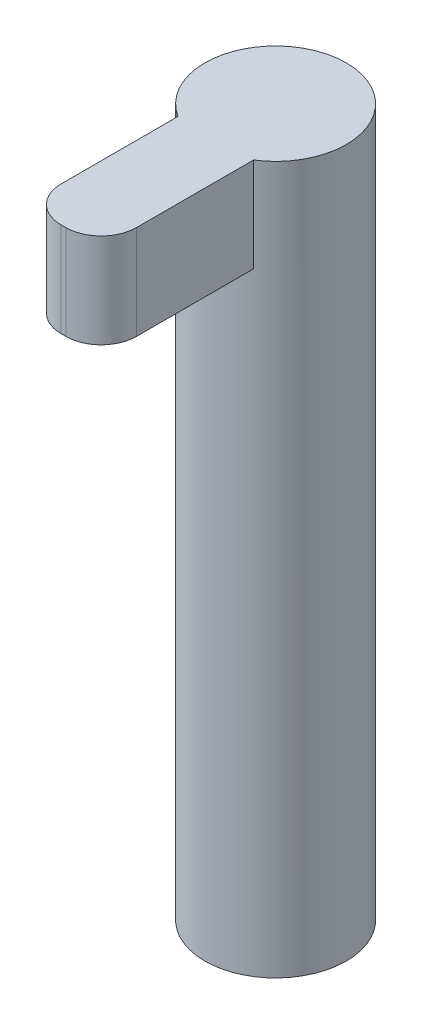
ISO-10303-21;
HEADER;
FILE_DESCRIPTION(('STEP AP214'),'2;1');
FILE_NAME('part.step','',(''),(''),'','','');
FILE_SCHEMA(('AUTOMOTIVE_DESIGN { 1 0 10303 214 1 1 1 1 }'));
ENDSEC;
DATA;
#1=APPLICATION_CONTEXT('core data for automotive mechanical design processes');
#2=APPLICATION_PROTOCOL_DEFINITION('international standard','automotive_design',2000,#1);
#3=PRODUCT_CONTEXT('',#1,'mechanical');
#4=PRODUCT('Part','Part','',(#3));
#5=PRODUCT_RELATED_PRODUCT_CATEGORY('part','',(#4));
#6=PRODUCT_DEFINITION_FORMATION('','',#4);
#7=PRODUCT_DEFINITION_CONTEXT('part definition',#1,'design');
#8=PRODUCT_DEFINITION('design','',#6,#7);
#9=PRODUCT_DEFINITION_SHAPE('','',#8);
#10=(LENGTH_UNIT() NAMED_UNIT(*) SI_UNIT(.MILLI.,.METRE.));
#11=(NAMED_UNIT(*) PLANE_ANGLE_UNIT() SI_UNIT($,.RADIAN.));
#12=(NAMED_UNIT(*) SI_UNIT($,.STERADIAN.) SOLID_ANGLE_UNIT());
#13=UNCERTAINTY_MEASURE_WITH_UNIT(LENGTH_MEASURE(1.E-05),#10,'distance_accuracy_value','');
#14=(GEOMETRIC_REPRESENTATION_CONTEXT(3) GLOBAL_UNCERTAINTY_ASSIGNED_CONTEXT((#13)) GLOBAL_UNIT_ASSIGNED_CONTEXT((#10,
#11,#12)) REPRESENTATION_CONTEXT('',''));
#15=CARTESIAN_POINT('',(0.,0.,0.));
#16=DIRECTION('',(0.,0.,1.));
#17=DIRECTION('',(1.,0.,0.));
#18=AXIS2_PLACEMENT_3D('',#15,#16,#17);
#19=CARTESIAN_POINT('',(0.,30.,0.));
#20=DIRECTION('',(0.,-1.,0.));
#21=DIRECTION('',(0.,0.,-1.));
#22=AXIS2_PLACEMENT_3D('',#19,#20,#21);
#23=CYLINDRICAL_SURFACE('',#22,3.);
#24=CARTESIAN_POINT('',(0.,0.,0.));
#25=DIRECTION('',(0.,1.,0.));
#26=DIRECTION('',(0.,0.,1.));
#27=AXIS2_PLACEMENT_3D('',#24,#25,#26);
#28=CIRCLE('',#27,3.);
#29=CARTESIAN_POINT('',(0.,0.,3.));
#30=VERTEX_POINT('',#29);
#31=EDGE_CURVE('E105',#30,#30,#28,.T.);
#32=ORIENTED_EDGE('',*,*,#31,.T.);
#33=EDGE_LOOP('',(#32));
#34=FACE_BOUND('',#33,.T.);
#35=DIRECTION('',(0.,-1.,0.));
#36=VECTOR('',#35,1.);
#37=CARTESIAN_POINT('',(1.60070437775267,30.,2.53727126950262));
#38=LINE('',#37,#36);
#39=CARTESIAN_POINT('',(1.60070437775267,26.,2.53727126950262));
#40=VERTEX_POINT('',#39);
#41=CARTESIAN_POINT('',(1.60070437775267,30.,2.53727126950262));
#42=VERTEX_POINT('',#41);
#43=EDGE_CURVE('E89',#40,#42,#38,.F.);
#44=ORIENTED_EDGE('',*,*,#43,.F.);
#45=CARTESIAN_POINT('',(0.,26.,0.));
#46=DIRECTION('',(0.,1.,0.));
#47=DIRECTION('',(0.,0.,1.));
#48=AXIS2_PLACEMENT_3D('',#45,#46,#47);
#49=CIRCLE('',#48,3.);
#50=CARTESIAN_POINT('',(-1.60070437775267,26.,2.53727126950262));
#51=VERTEX_POINT('',#50);
#52=EDGE_CURVE('E101',#51,#40,#49,.T.);
#53=ORIENTED_EDGE('',*,*,#52,.F.);
#54=DIRECTION('',(0.,-1.,0.));
#55=VECTOR('',#54,1.);
#56=CARTESIAN_POINT('',(-1.60070437775267,30.,2.53727126950262));
#57=LINE('',#56,#55);
#58=CARTESIAN_POINT('',(-1.60070437775267,30.,2.53727126950262));
#59=VERTEX_POINT('',#58);
#60=EDGE_CURVE('E106',#59,#51,#57,.T.);
#61=ORIENTED_EDGE('',*,*,#60,.F.);
#62=CARTESIAN_POINT('',(0.,30.,0.));
#63=DIRECTION('',(0.,1.,0.));
#64=DIRECTION('',(0.,0.,1.));
#65=AXIS2_PLACEMENT_3D('',#62,#63,#64);
#66=CIRCLE('',#65,3.);
#67=EDGE_CURVE('E104',#42,#59,#66,.T.);
#68=ORIENTED_EDGE('',*,*,#67,.F.);
#69=EDGE_LOOP('',(#44,#53,#61,#68));
#70=FACE_BOUND('',#69,.T.);
#71=ADVANCED_FACE('F33',(#34,#70),#23,.T.);
#72=CARTESIAN_POINT('',(0.,30.,0.));
#73=DIRECTION('',(0.,1.,0.));
#74=DIRECTION('',(0.,0.,1.));
#75=AXIS2_PLACEMENT_3D('',#72,#73,#74);
#76=PLANE('',#75);
#77=DIRECTION('',(0.,0.,-1.));
#78=VECTOR('',#77,1.);
#79=CARTESIAN_POINT('',(-1.60070437775267,30.,9.));
#80=LINE('',#79,#78);
#81=CARTESIAN_POINT('',(-1.60070437775267,30.,7.5));
#82=VERTEX_POINT('',#81);
#83=EDGE_CURVE('E129',#82,#59,#80,.T.);
#84=ORIENTED_EDGE('',*,*,#83,.F.);
#85=CARTESIAN_POINT('',(-0.100704377752665,30.,7.5));
#86=DIRECTION('',(0.,1.,0.));
#87=DIRECTION('',(0.,0.,1.));
#88=AXIS2_PLACEMENT_3D('',#85,#86,#87);
#89=CIRCLE('',#88,1.5);
#90=CARTESIAN_POINT('',(-0.100704377752665,30.,9.));
#91=VERTEX_POINT('',#90);
#92=EDGE_CURVE('E41',#82,#91,#89,.T.);
#93=ORIENTED_EDGE('',*,*,#92,.T.);
#94=DIRECTION('',(-1.,0.,0.));
#95=VECTOR('',#94,1.);
#96=CARTESIAN_POINT('',(-1.60070437775267,30.,9.));
#97=LINE('',#96,#95);
#98=CARTESIAN_POINT('',(0.100704377752671,30.,9.));
#99=VERTEX_POINT('',#98);
#100=EDGE_CURVE('E128',#99,#91,#97,.T.);
#101=ORIENTED_EDGE('',*,*,#100,.F.);
#102=CARTESIAN_POINT('',(0.100704377752671,30.,7.5));
#103=DIRECTION('',(0.,1.,0.));
#104=DIRECTION('',(0.,0.,1.));
#105=AXIS2_PLACEMENT_3D('',#102,#103,#104);
#106=CIRCLE('',#105,1.5);
#107=CARTESIAN_POINT('',(1.60070437775267,30.,7.5));
#108=VERTEX_POINT('',#107);
#109=EDGE_CURVE('E48',#99,#108,#106,.T.);
#110=ORIENTED_EDGE('',*,*,#109,.T.);
#111=DIRECTION('',(0.,0.,-1.));
#112=VECTOR('',#111,1.);
#113=CARTESIAN_POINT('',(1.60070437775267,30.,9.));
#114=LINE('',#113,#112);
#115=EDGE_CURVE('E140',#108,#42,#114,.T.);
#116=ORIENTED_EDGE('',*,*,#115,.T.);
#117=ORIENTED_EDGE('',*,*,#67,.T.);
#118=EDGE_LOOP('',(#84,#93,#101,#110,#116,#117));
#119=FACE_BOUND('',#118,.T.);
#120=ADVANCED_FACE('F127',(#119),#76,.T.);
#121=CARTESIAN_POINT('',(0.,0.,0.));
#122=DIRECTION('',(0.,1.,0.));
#123=DIRECTION('',(0.,0.,1.));
#124=AXIS2_PLACEMENT_3D('',#121,#122,#123);
#125=PLANE('',#124);
#126=ORIENTED_EDGE('',*,*,#31,.F.);
#127=EDGE_LOOP('',(#126));
#128=FACE_BOUND('',#127,.T.);
#129=ADVANCED_FACE('F156',(#128),#125,.F.);
#130=CARTESIAN_POINT('',(1.60070437775267,26.,9.));
#131=DIRECTION('',(-1.,0.,0.));
#132=DIRECTION('',(0.,0.,1.));
#133=AXIS2_PLACEMENT_3D('',#130,#131,#132);
#134=PLANE('',#133);
#135=ORIENTED_EDGE('',*,*,#115,.F.);
#136=DIRECTION('',(0.,1.,0.));
#137=VECTOR('',#136,1.);
#138=CARTESIAN_POINT('',(1.60070437775267,26.,7.5));
#139=LINE('',#138,#137);
#140=CARTESIAN_POINT('',(1.60070437775267,26.,7.5));
#141=VERTEX_POINT('',#140);
#142=EDGE_CURVE('E11',#108,#141,#139,.F.);
#143=ORIENTED_EDGE('',*,*,#142,.T.);
#144=DIRECTION('',(0.,0.,-1.));
#145=VECTOR('',#144,1.);
#146=CARTESIAN_POINT('',(1.60070437775267,26.,9.));
#147=LINE('',#146,#145);
#148=EDGE_CURVE('E86',#141,#40,#147,.T.);
#149=ORIENTED_EDGE('',*,*,#148,.T.);
#150=ORIENTED_EDGE('',*,*,#43,.T.);
#151=EDGE_LOOP('',(#135,#143,#149,#150));
#152=FACE_BOUND('',#151,.T.);
#153=ADVANCED_FACE('F88',(#152),#134,.F.);
#154=CARTESIAN_POINT('',(-1.60070437775267,26.,9.));
#155=DIRECTION('',(1.,0.,0.));
#156=DIRECTION('',(0.,1.,0.));
#157=AXIS2_PLACEMENT_3D('',#154,#155,#156);
#158=PLANE('',#157);
#159=DIRECTION('',(0.,0.,-1.));
#160=VECTOR('',#159,1.);
#161=CARTESIAN_POINT('',(-1.60070437775267,26.,9.));
#162=LINE('',#161,#160);
#163=CARTESIAN_POINT('',(-1.60070437775267,26.,7.5));
#164=VERTEX_POINT('',#163);
#165=EDGE_CURVE('E94',#164,#51,#162,.T.);
#166=ORIENTED_EDGE('',*,*,#165,.F.);
#167=DIRECTION('',(0.,-1.,0.));
#168=VECTOR('',#167,1.);
#169=CARTESIAN_POINT('',(-1.60070437775267,26.,7.5));
#170=LINE('',#169,#168);
#171=EDGE_CURVE('E56',#164,#82,#170,.F.);
#172=ORIENTED_EDGE('',*,*,#171,.T.);
#173=ORIENTED_EDGE('',*,*,#83,.T.);
#174=ORIENTED_EDGE('',*,*,#60,.T.);
#175=EDGE_LOOP('',(#166,#172,#173,#174));
#176=FACE_BOUND('',#175,.T.);
#177=ADVANCED_FACE('F138',(#176),#158,.F.);
#178=CARTESIAN_POINT('',(-1.60070437775267,26.,9.));
#179=DIRECTION('',(0.,1.,0.));
#180=DIRECTION('',(0.,0.,1.));
#181=AXIS2_PLACEMENT_3D('',#178,#179,#180);
#182=PLANE('',#181);
#183=DIRECTION('',(1.,0.,0.));
#184=VECTOR('',#183,1.);
#185=CARTESIAN_POINT('',(-1.60070437775267,26.,9.));
#186=LINE('',#185,#184);
#187=CARTESIAN_POINT('',(-0.100704377752666,26.,9.));
#188=VERTEX_POINT('',#187);
#189=CARTESIAN_POINT('',(0.100704377752671,26.,9.));
#190=VERTEX_POINT('',#189);
#191=EDGE_CURVE('E95',#188,#190,#186,.T.);
#192=ORIENTED_EDGE('',*,*,#191,.F.);
#193=CARTESIAN_POINT('',(-0.100704377752666,26.,7.5));
#194=DIRECTION('',(0.,1.,0.));
#195=DIRECTION('',(0.,0.,1.));
#196=AXIS2_PLACEMENT_3D('',#193,#194,#195);
#197=CIRCLE('',#196,1.5);
#198=EDGE_CURVE('E122',#188,#164,#197,.F.);
#199=ORIENTED_EDGE('',*,*,#198,.T.);
#200=ORIENTED_EDGE('',*,*,#165,.T.);
#201=ORIENTED_EDGE('',*,*,#52,.T.);
#202=ORIENTED_EDGE('',*,*,#148,.F.);
#203=CARTESIAN_POINT('',(0.100704377752671,26.,7.5));
#204=DIRECTION('',(0.,1.,0.));
#205=DIRECTION('',(0.,0.,1.));
#206=AXIS2_PLACEMENT_3D('',#203,#204,#205);
#207=CIRCLE('',#206,1.5);
#208=EDGE_CURVE('E120',#141,#190,#207,.F.);
#209=ORIENTED_EDGE('',*,*,#208,.T.);
#210=EDGE_LOOP('',(#192,#199,#200,#201,#202,#209));
#211=FACE_BOUND('',#210,.T.);
#212=ADVANCED_FACE('F109',(#211),#182,.F.);
#213=CARTESIAN_POINT('',(0.,0.,9.));
#214=DIRECTION('',(0.,0.,-1.));
#215=DIRECTION('',(-1.,0.,0.));
#216=AXIS2_PLACEMENT_3D('',#213,#214,#215);
#217=PLANE('',#216);
#218=ORIENTED_EDGE('',*,*,#100,.T.);
#219=DIRECTION('',(0.,-1.,0.));
#220=VECTOR('',#219,1.);
#221=CARTESIAN_POINT('',(-0.100704377752674,0.,9.));
#222=LINE('',#221,#220);
#223=EDGE_CURVE('E113',#91,#188,#222,.T.);
#224=ORIENTED_EDGE('',*,*,#223,.T.);
#225=ORIENTED_EDGE('',*,*,#191,.T.);
#226=DIRECTION('',(0.,1.,0.));
#227=VECTOR('',#226,1.);
#228=CARTESIAN_POINT('',(0.100704377752671,0.,9.));
#229=LINE('',#228,#227);
#230=EDGE_CURVE('E110',#190,#99,#229,.T.);
#231=ORIENTED_EDGE('',*,*,#230,.T.);
#232=EDGE_LOOP('',(#218,#224,#225,#231));
#233=FACE_BOUND('',#232,.T.);
#234=ADVANCED_FACE('F133',(#233),#217,.F.);
#235=CARTESIAN_POINT('',(-0.100704377752674,0.,7.5));
#236=DIRECTION('',(0.,-1.,0.));
#237=DIRECTION('',(1.,0.,0.));
#238=AXIS2_PLACEMENT_3D('',#235,#236,#237);
#239=CYLINDRICAL_SURFACE('',#238,1.5);
#240=ORIENTED_EDGE('',*,*,#92,.F.);
#241=ORIENTED_EDGE('',*,*,#171,.F.);
#242=ORIENTED_EDGE('',*,*,#198,.F.);
#243=ORIENTED_EDGE('',*,*,#223,.F.);
#244=EDGE_LOOP('',(#240,#241,#242,#243));
#245=FACE_BOUND('',#244,.T.);
#246=ADVANCED_FACE('F137',(#245),#239,.T.);
#247=CARTESIAN_POINT('',(0.100704377752671,0.,7.5));
#248=DIRECTION('',(0.,1.,0.));
#249=DIRECTION('',(0.,0.,1.));
#250=AXIS2_PLACEMENT_3D('',#247,#248,#249);
#251=CYLINDRICAL_SURFACE('',#250,1.5);
#252=ORIENTED_EDGE('',*,*,#208,.F.);
#253=ORIENTED_EDGE('',*,*,#142,.F.);
#254=ORIENTED_EDGE('',*,*,#109,.F.);
#255=ORIENTED_EDGE('',*,*,#230,.F.);
#256=EDGE_LOOP('',(#252,#253,#254,#255));
#257=FACE_BOUND('',#256,.T.);
#258=ADVANCED_FACE('F35',(#257),#251,.T.);
#259=CLOSED_SHELL('',(#71,#120,#129,#153,#177,#212,#234,#246,#258));
#260=MANIFOLD_SOLID_BREP('B2',#259);
#261=ADVANCED_BREP_SHAPE_REPRESENTATION('',(#18,#260),#14);
#262=SHAPE_DEFINITION_REPRESENTATION(#9,#261);
ENDSEC;
END-ISO-10303-21;
